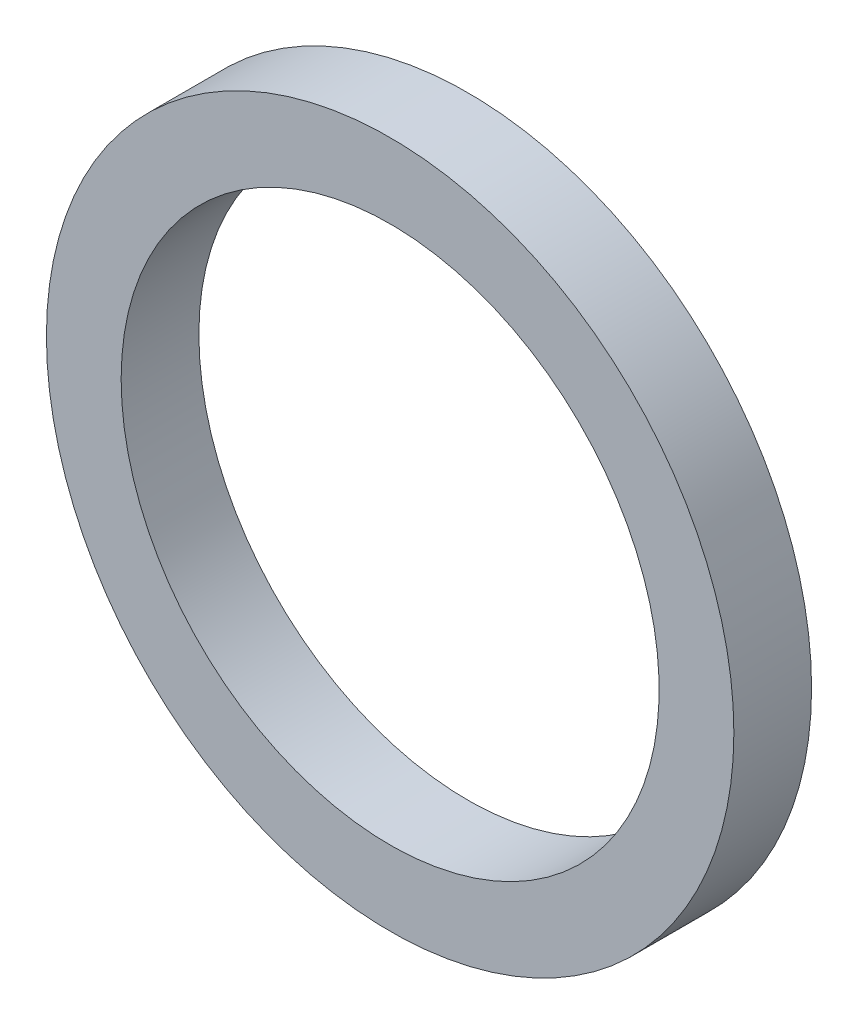
ISO-10303-21;
HEADER;
FILE_DESCRIPTION(('STEP AP214'),'2;1');
FILE_NAME('part.step','',(''),(''),'','','');
FILE_SCHEMA(('AUTOMOTIVE_DESIGN { 1 0 10303 214 1 1 1 1 }'));
ENDSEC;
DATA;
#1=APPLICATION_CONTEXT('core data for automotive mechanical design processes');
#2=APPLICATION_PROTOCOL_DEFINITION('international standard','automotive_design',2000,#1);
#3=PRODUCT_CONTEXT('',#1,'mechanical');
#4=PRODUCT('Part','Part','',(#3));
#5=PRODUCT_RELATED_PRODUCT_CATEGORY('part','',(#4));
#6=PRODUCT_DEFINITION_FORMATION('','',#4);
#7=PRODUCT_DEFINITION_CONTEXT('part definition',#1,'design');
#8=PRODUCT_DEFINITION('design','',#6,#7);
#9=PRODUCT_DEFINITION_SHAPE('','',#8);
#10=(LENGTH_UNIT() NAMED_UNIT(*) SI_UNIT(.MILLI.,.METRE.));
#11=(NAMED_UNIT(*) PLANE_ANGLE_UNIT() SI_UNIT($,.RADIAN.));
#12=(NAMED_UNIT(*) SI_UNIT($,.STERADIAN.) SOLID_ANGLE_UNIT());
#13=UNCERTAINTY_MEASURE_WITH_UNIT(LENGTH_MEASURE(1.E-05),#10,'distance_accuracy_value','');
#14=(GEOMETRIC_REPRESENTATION_CONTEXT(3) GLOBAL_UNCERTAINTY_ASSIGNED_CONTEXT((#13)) GLOBAL_UNIT_ASSIGNED_CONTEXT((#10,
#11,#12)) REPRESENTATION_CONTEXT('',''));
#15=CARTESIAN_POINT('',(0.,0.,0.));
#16=DIRECTION('',(0.,0.,1.));
#17=DIRECTION('',(1.,0.,0.));
#18=AXIS2_PLACEMENT_3D('',#15,#16,#17);
#19=CARTESIAN_POINT('',(0.,0.,13.));
#20=DIRECTION('',(0.,0.,1.));
#21=DIRECTION('',(1.,0.,0.));
#22=AXIS2_PLACEMENT_3D('',#19,#20,#21);
#23=PLANE('',#22);
#24=CARTESIAN_POINT('',(0.,0.,13.));
#25=DIRECTION('',(0.,0.,1.));
#26=DIRECTION('',(1.,0.,0.));
#27=AXIS2_PLACEMENT_3D('',#24,#25,#26);
#28=CIRCLE('',#27,57.5);
#29=CARTESIAN_POINT('',(-57.5,0.,13.));
#30=VERTEX_POINT('',#29);
#31=EDGE_CURVE('E10',#30,#30,#28,.T.);
#32=ORIENTED_EDGE('',*,*,#31,.T.);
#33=EDGE_LOOP('',(#32));
#34=FACE_BOUND('',#33,.T.);
#35=CARTESIAN_POINT('',(0.,0.,13.));
#36=DIRECTION('',(0.,0.,1.));
#37=DIRECTION('',(1.,0.,0.));
#38=AXIS2_PLACEMENT_3D('',#35,#36,#37);
#39=CIRCLE('',#38,45.);
#40=CARTESIAN_POINT('',(-45.,0.,13.));
#41=VERTEX_POINT('',#40);
#42=EDGE_CURVE('E45',#41,#41,#39,.T.);
#43=ORIENTED_EDGE('',*,*,#42,.F.);
#44=EDGE_LOOP('',(#43));
#45=FACE_BOUND('',#44,.T.);
#46=ADVANCED_FACE('F34',(#34,#45),#23,.T.);
#47=CARTESIAN_POINT('',(0.,0.,0.));
#48=DIRECTION('',(0.,0.,1.));
#49=DIRECTION('',(1.,0.,0.));
#50=AXIS2_PLACEMENT_3D('',#47,#48,#49);
#51=PLANE('',#50);
#52=CARTESIAN_POINT('',(0.,0.,0.));
#53=DIRECTION('',(0.,0.,1.));
#54=DIRECTION('',(1.,0.,0.));
#55=AXIS2_PLACEMENT_3D('',#52,#53,#54);
#56=CIRCLE('',#55,57.5);
#57=CARTESIAN_POINT('',(-57.5,0.,0.));
#58=VERTEX_POINT('',#57);
#59=EDGE_CURVE('E38',#58,#58,#56,.T.);
#60=ORIENTED_EDGE('',*,*,#59,.F.);
#61=EDGE_LOOP('',(#60));
#62=FACE_BOUND('',#61,.T.);
#63=CARTESIAN_POINT('',(0.,0.,0.));
#64=DIRECTION('',(0.,0.,1.));
#65=DIRECTION('',(1.,0.,0.));
#66=AXIS2_PLACEMENT_3D('',#63,#64,#65);
#67=CIRCLE('',#66,45.);
#68=CARTESIAN_POINT('',(-45.,0.,0.));
#69=VERTEX_POINT('',#68);
#70=EDGE_CURVE('E47',#69,#69,#67,.T.);
#71=ORIENTED_EDGE('',*,*,#70,.T.);
#72=EDGE_LOOP('',(#71));
#73=FACE_BOUND('',#72,.T.);
#74=ADVANCED_FACE('F57',(#62,#73),#51,.F.);
#75=CARTESIAN_POINT('',(0.,0.,13.));
#76=DIRECTION('',(0.,0.,-1.));
#77=DIRECTION('',(-1.,0.,0.));
#78=AXIS2_PLACEMENT_3D('',#75,#76,#77);
#79=CYLINDRICAL_SURFACE('',#78,57.5);
#80=CARTESIAN_POINT('',(-57.5,0.,13.));
#81=CARTESIAN_POINT('',(-57.5,0.,12.8645833333333));
#82=CARTESIAN_POINT('',(-57.5,0.,12.7291666666667));
#83=CARTESIAN_POINT('',(-57.5,0.,12.4583333333333));
#84=CARTESIAN_POINT('',(-57.5,0.,12.3229166666667));
#85=CARTESIAN_POINT('',(-57.5,0.,12.0520833333333));
#86=CARTESIAN_POINT('',(-57.5,0.,11.9166666666667));
#87=CARTESIAN_POINT('',(-57.5,0.,11.6458333333333));
#88=CARTESIAN_POINT('',(-57.5,0.,11.5104166666667));
#89=CARTESIAN_POINT('',(-57.5,0.,11.2395833333333));
#90=CARTESIAN_POINT('',(-57.5,0.,11.1041666666667));
#91=CARTESIAN_POINT('',(-57.5,0.,10.8333333333333));
#92=CARTESIAN_POINT('',(-57.5,0.,10.6979166666667));
#93=CARTESIAN_POINT('',(-57.5,0.,10.4270833333333));
#94=CARTESIAN_POINT('',(-57.5,0.,10.2916666666667));
#95=CARTESIAN_POINT('',(-57.5,0.,10.0208333333333));
#96=CARTESIAN_POINT('',(-57.5,0.,9.88541666666667));
#97=CARTESIAN_POINT('',(-57.5,0.,9.61458333333333));
#98=CARTESIAN_POINT('',(-57.5,0.,9.47916666666667));
#99=CARTESIAN_POINT('',(-57.5,0.,9.20833333333333));
#100=CARTESIAN_POINT('',(-57.5,0.,9.07291666666667));
#101=CARTESIAN_POINT('',(-57.5,0.,8.80208333333333));
#102=CARTESIAN_POINT('',(-57.5,0.,8.66666666666667));
#103=CARTESIAN_POINT('',(-57.5,0.,8.39583333333333));
#104=CARTESIAN_POINT('',(-57.5,0.,8.26041666666667));
#105=CARTESIAN_POINT('',(-57.5,0.,7.98958333333333));
#106=CARTESIAN_POINT('',(-57.5,0.,7.85416666666667));
#107=CARTESIAN_POINT('',(-57.5,0.,7.58333333333333));
#108=CARTESIAN_POINT('',(-57.5,0.,7.44791666666667));
#109=CARTESIAN_POINT('',(-57.5,0.,7.17708333333333));
#110=CARTESIAN_POINT('',(-57.5,0.,7.04166666666667));
#111=CARTESIAN_POINT('',(-57.5,0.,6.77083333333333));
#112=CARTESIAN_POINT('',(-57.5,0.,6.63541666666667));
#113=CARTESIAN_POINT('',(-57.5,0.,6.36458333333333));
#114=CARTESIAN_POINT('',(-57.5,0.,6.22916666666667));
#115=CARTESIAN_POINT('',(-57.5,0.,5.95833333333333));
#116=CARTESIAN_POINT('',(-57.5,0.,5.82291666666667));
#117=CARTESIAN_POINT('',(-57.5,0.,5.55208333333333));
#118=CARTESIAN_POINT('',(-57.5,0.,5.41666666666667));
#119=CARTESIAN_POINT('',(-57.5,0.,5.14583333333333));
#120=CARTESIAN_POINT('',(-57.5,0.,5.01041666666667));
#121=CARTESIAN_POINT('',(-57.5,0.,4.73958333333333));
#122=CARTESIAN_POINT('',(-57.5,0.,4.60416666666667));
#123=CARTESIAN_POINT('',(-57.5,0.,4.33333333333333));
#124=CARTESIAN_POINT('',(-57.5,0.,4.19791666666667));
#125=CARTESIAN_POINT('',(-57.5,0.,3.92708333333333));
#126=CARTESIAN_POINT('',(-57.5,0.,3.79166666666667));
#127=CARTESIAN_POINT('',(-57.5,0.,3.52083333333333));
#128=CARTESIAN_POINT('',(-57.5,0.,3.38541666666667));
#129=CARTESIAN_POINT('',(-57.5,0.,3.11458333333333));
#130=CARTESIAN_POINT('',(-57.5,0.,2.97916666666667));
#131=CARTESIAN_POINT('',(-57.5,0.,2.70833333333333));
#132=CARTESIAN_POINT('',(-57.5,0.,2.57291666666667));
#133=CARTESIAN_POINT('',(-57.5,0.,2.30208333333333));
#134=CARTESIAN_POINT('',(-57.5,0.,2.16666666666667));
#135=CARTESIAN_POINT('',(-57.5,0.,1.89583333333333));
#136=CARTESIAN_POINT('',(-57.5,0.,1.76041666666667));
#137=CARTESIAN_POINT('',(-57.5,0.,1.48958333333333));
#138=CARTESIAN_POINT('',(-57.5,0.,1.35416666666667));
#139=CARTESIAN_POINT('',(-57.5,0.,1.08333333333333));
#140=CARTESIAN_POINT('',(-57.5,0.,0.947916666666667));
#141=CARTESIAN_POINT('',(-57.5,0.,0.677083333333334));
#142=CARTESIAN_POINT('',(-57.5,0.,0.541666666666667));
#143=CARTESIAN_POINT('',(-57.5,0.,0.270833333333334));
#144=CARTESIAN_POINT('',(-57.5,0.,0.135416666666667));
#145=CARTESIAN_POINT('',(-57.5,0.,0.));
#146=B_SPLINE_CURVE_WITH_KNOTS('',3,(#80,#81,#82,#83,#84,#85,#86,#87,#88,#89,#90,#91,#92,#93,
#94,#95,#96,#97,#98,#99,#100,#101,#102,#103,#104,#105,#106,#107,#108,#109,#110,#111,#112,#113,
#114,#115,#116,#117,#118,#119,#120,#121,#122,#123,#124,#125,#126,#127,#128,#129,#130,#131,#132,
#133,#134,#135,#136,#137,#138,#139,#140,#141,#142,#143,#144,#145),.UNSPECIFIED.,.F.,.F.,(4,2,2,
2,2,2,2,2,2,2,2,2,2,2,2,2,2,2,2,2,2,2,2,2,2,2,2,2,2,2,2,2,4),(0.,0.406249999999999,
0.812499999999999,1.21875,1.625,2.03125,2.4375,2.84375,3.25,3.65625,4.0625,4.46875,4.875,
5.28125,5.6875,6.09375,6.5,6.90625,7.3125,7.71875,8.125,8.53125,8.9375,9.34375,9.75,10.15625,
10.5625,10.96875,11.375,11.78125,12.1875,12.59375,13.),.UNSPECIFIED.);
#147=EDGE_CURVE('BSEAM36',#30,#58,#146,.T.);
#148=ORIENTED_EDGE('',*,*,#31,.F.);
#149=ORIENTED_EDGE('',*,*,#59,.T.);
#150=ORIENTED_EDGE('',*,*,#147,.T.);
#151=ORIENTED_EDGE('',*,*,#147,.F.);
#152=EDGE_LOOP('',(#148,#150,#149,#151));
#153=FACE_BOUND('',#152,.T.);
#154=ADVANCED_FACE('F36',(#153),#79,.T.);
#155=CARTESIAN_POINT('',(0.,0.,13.));
#156=DIRECTION('',(0.,0.,-1.));
#157=DIRECTION('',(-1.,0.,0.));
#158=AXIS2_PLACEMENT_3D('',#155,#156,#157);
#159=CYLINDRICAL_SURFACE('',#158,45.);
#160=CARTESIAN_POINT('',(-45.,0.,13.));
#161=CARTESIAN_POINT('',(-45.,0.,12.8645833333333));
#162=CARTESIAN_POINT('',(-45.,0.,12.7291666666667));
#163=CARTESIAN_POINT('',(-45.,0.,12.4583333333333));
#164=CARTESIAN_POINT('',(-45.,0.,12.3229166666667));
#165=CARTESIAN_POINT('',(-45.,0.,12.0520833333333));
#166=CARTESIAN_POINT('',(-45.,0.,11.9166666666667));
#167=CARTESIAN_POINT('',(-45.,0.,11.6458333333333));
#168=CARTESIAN_POINT('',(-45.,0.,11.5104166666667));
#169=CARTESIAN_POINT('',(-45.,0.,11.2395833333333));
#170=CARTESIAN_POINT('',(-45.,0.,11.1041666666667));
#171=CARTESIAN_POINT('',(-45.,0.,10.8333333333333));
#172=CARTESIAN_POINT('',(-45.,0.,10.6979166666667));
#173=CARTESIAN_POINT('',(-45.,0.,10.4270833333333));
#174=CARTESIAN_POINT('',(-45.,0.,10.2916666666667));
#175=CARTESIAN_POINT('',(-45.,0.,10.0208333333333));
#176=CARTESIAN_POINT('',(-45.,0.,9.88541666666667));
#177=CARTESIAN_POINT('',(-45.,0.,9.61458333333333));
#178=CARTESIAN_POINT('',(-45.,0.,9.47916666666667));
#179=CARTESIAN_POINT('',(-45.,0.,9.20833333333333));
#180=CARTESIAN_POINT('',(-45.,0.,9.07291666666666));
#181=CARTESIAN_POINT('',(-45.,0.,8.80208333333333));
#182=CARTESIAN_POINT('',(-45.,0.,8.66666666666667));
#183=CARTESIAN_POINT('',(-45.,0.,8.39583333333333));
#184=CARTESIAN_POINT('',(-45.,0.,8.26041666666667));
#185=CARTESIAN_POINT('',(-45.,0.,7.98958333333333));
#186=CARTESIAN_POINT('',(-45.,0.,7.85416666666667));
#187=CARTESIAN_POINT('',(-45.,0.,7.58333333333333));
#188=CARTESIAN_POINT('',(-45.,0.,7.44791666666667));
#189=CARTESIAN_POINT('',(-45.,0.,7.17708333333333));
#190=CARTESIAN_POINT('',(-45.,0.,7.04166666666667));
#191=CARTESIAN_POINT('',(-45.,0.,6.77083333333333));
#192=CARTESIAN_POINT('',(-45.,0.,6.63541666666667));
#193=CARTESIAN_POINT('',(-45.,0.,6.36458333333333));
#194=CARTESIAN_POINT('',(-45.,0.,6.22916666666667));
#195=CARTESIAN_POINT('',(-45.,0.,5.95833333333333));
#196=CARTESIAN_POINT('',(-45.,0.,5.82291666666667));
#197=CARTESIAN_POINT('',(-45.,0.,5.55208333333333));
#198=CARTESIAN_POINT('',(-45.,0.,5.41666666666667));
#199=CARTESIAN_POINT('',(-45.,0.,5.14583333333333));
#200=CARTESIAN_POINT('',(-45.,0.,5.01041666666667));
#201=CARTESIAN_POINT('',(-45.,0.,4.73958333333333));
#202=CARTESIAN_POINT('',(-45.,0.,4.60416666666667));
#203=CARTESIAN_POINT('',(-45.,0.,4.33333333333333));
#204=CARTESIAN_POINT('',(-45.,0.,4.19791666666667));
#205=CARTESIAN_POINT('',(-45.,0.,3.92708333333333));
#206=CARTESIAN_POINT('',(-45.,0.,3.79166666666667));
#207=CARTESIAN_POINT('',(-45.,0.,3.52083333333333));
#208=CARTESIAN_POINT('',(-45.,0.,3.38541666666667));
#209=CARTESIAN_POINT('',(-45.,0.,3.11458333333333));
#210=CARTESIAN_POINT('',(-45.,0.,2.97916666666667));
#211=CARTESIAN_POINT('',(-45.,0.,2.70833333333333));
#212=CARTESIAN_POINT('',(-45.,0.,2.57291666666667));
#213=CARTESIAN_POINT('',(-45.,0.,2.30208333333333));
#214=CARTESIAN_POINT('',(-45.,0.,2.16666666666667));
#215=CARTESIAN_POINT('',(-45.,0.,1.89583333333333));
#216=CARTESIAN_POINT('',(-45.,0.,1.76041666666667));
#217=CARTESIAN_POINT('',(-45.,0.,1.48958333333333));
#218=CARTESIAN_POINT('',(-45.,0.,1.35416666666667));
#219=CARTESIAN_POINT('',(-45.,0.,1.08333333333333));
#220=CARTESIAN_POINT('',(-45.,0.,0.947916666666667));
#221=CARTESIAN_POINT('',(-45.,0.,0.677083333333334));
#222=CARTESIAN_POINT('',(-45.,0.,0.541666666666667));
#223=CARTESIAN_POINT('',(-45.,0.,0.270833333333334));
#224=CARTESIAN_POINT('',(-45.,0.,0.135416666666667));
#225=CARTESIAN_POINT('',(-45.,0.,0.));
#226=B_SPLINE_CURVE_WITH_KNOTS('',3,(#160,#161,#162,#163,#164,#165,#166,#167,#168,#169,#170,
#171,#172,#173,#174,#175,#176,#177,#178,#179,#180,#181,#182,#183,#184,#185,#186,#187,#188,#189,
#190,#191,#192,#193,#194,#195,#196,#197,#198,#199,#200,#201,#202,#203,#204,#205,#206,#207,#208,
#209,#210,#211,#212,#213,#214,#215,#216,#217,#218,#219,#220,#221,#222,#223,#224,#225),
.UNSPECIFIED.,.F.,.F.,(4,2,2,2,2,2,2,2,2,2,2,2,2,2,2,2,2,2,2,2,2,2,2,2,2,2,2,2,2,2,2,2,4),(0.,
0.40625,0.812500000000001,1.21875,1.625,2.03125,2.4375,2.84375,3.25,3.65625,4.0625,4.46875,
4.875,5.28125,5.6875,6.09375,6.5,6.90625,7.3125,7.71875,8.125,8.53125,8.9375,9.34375,9.75,
10.15625,10.5625,10.96875,11.375,11.78125,12.1875,12.59375,13.),.UNSPECIFIED.);
#227=EDGE_CURVE('BSEAM53',#41,#69,#226,.T.);
#228=ORIENTED_EDGE('',*,*,#42,.T.);
#229=ORIENTED_EDGE('',*,*,#70,.F.);
#230=ORIENTED_EDGE('',*,*,#227,.T.);
#231=ORIENTED_EDGE('',*,*,#227,.F.);
#232=EDGE_LOOP('',(#228,#230,#229,#231));
#233=FACE_BOUND('',#232,.T.);
#234=ADVANCED_FACE('F53',(#233),#159,.F.);
#235=CLOSED_SHELL('',(#46,#74,#154,#234));
#236=MANIFOLD_SOLID_BREP('B2',#235);
#237=ADVANCED_BREP_SHAPE_REPRESENTATION('',(#18,#236),#14);
#238=SHAPE_DEFINITION_REPRESENTATION(#9,#237);
ENDSEC;
END-ISO-10303-21;
